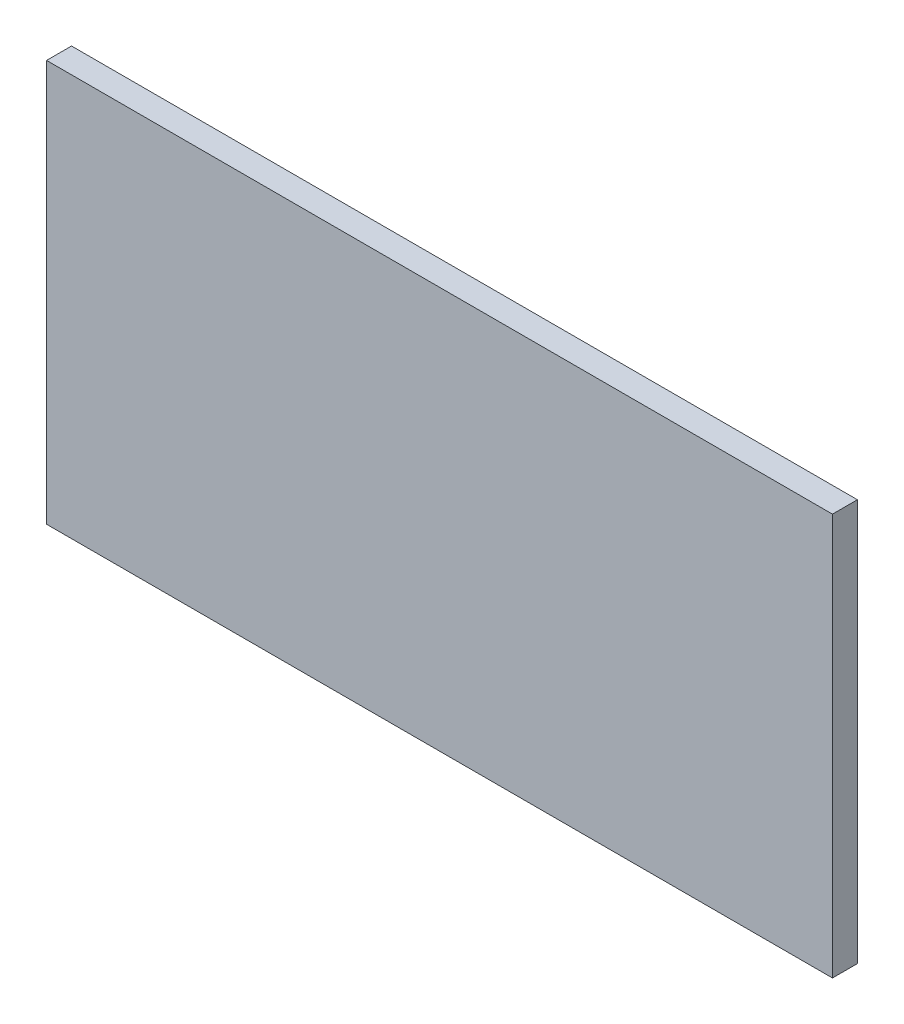
ISO-10303-21;
HEADER;
FILE_DESCRIPTION(('STEP AP214'),'2;1');
FILE_NAME('part.step','',(''),(''),'','','');
FILE_SCHEMA(('AUTOMOTIVE_DESIGN { 1 0 10303 214 1 1 1 1 }'));
ENDSEC;
DATA;
#1=APPLICATION_CONTEXT('core data for automotive mechanical design processes');
#2=APPLICATION_PROTOCOL_DEFINITION('international standard','automotive_design',2000,#1);
#3=PRODUCT_CONTEXT('',#1,'mechanical');
#4=PRODUCT('Part','Part','',(#3));
#5=PRODUCT_RELATED_PRODUCT_CATEGORY('part','',(#4));
#6=PRODUCT_DEFINITION_FORMATION('','',#4);
#7=PRODUCT_DEFINITION_CONTEXT('part definition',#1,'design');
#8=PRODUCT_DEFINITION('design','',#6,#7);
#9=PRODUCT_DEFINITION_SHAPE('','',#8);
#10=(LENGTH_UNIT() NAMED_UNIT(*) SI_UNIT(.MILLI.,.METRE.));
#11=(NAMED_UNIT(*) PLANE_ANGLE_UNIT() SI_UNIT($,.RADIAN.));
#12=(NAMED_UNIT(*) SI_UNIT($,.STERADIAN.) SOLID_ANGLE_UNIT());
#13=UNCERTAINTY_MEASURE_WITH_UNIT(LENGTH_MEASURE(1.E-05),#10,'distance_accuracy_value','');
#14=(GEOMETRIC_REPRESENTATION_CONTEXT(3) GLOBAL_UNCERTAINTY_ASSIGNED_CONTEXT((#13)) GLOBAL_UNIT_ASSIGNED_CONTEXT((#10,
#11,#12)) REPRESENTATION_CONTEXT('',''));
#15=CARTESIAN_POINT('',(0.,0.,0.));
#16=DIRECTION('',(0.,0.,1.));
#17=DIRECTION('',(1.,0.,0.));
#18=AXIS2_PLACEMENT_3D('',#15,#16,#17);
#19=CARTESIAN_POINT('',(-15.748,8.04999914,0.));
#20=DIRECTION('',(1.,0.,0.));
#21=DIRECTION('',(0.,-1.,0.));
#22=AXIS2_PLACEMENT_3D('',#19,#20,#21);
#23=PLANE('',#22);
#24=DIRECTION('',(0.,-1.,0.));
#25=VECTOR('',#24,1.);
#26=CARTESIAN_POINT('',(-15.748,8.04999914,0.));
#27=LINE('',#26,#25);
#28=CARTESIAN_POINT('',(-15.748,8.04999914,0.));
#29=VERTEX_POINT('',#28);
#30=CARTESIAN_POINT('',(-15.748,-8.04999914,0.));
#31=VERTEX_POINT('',#30);
#32=EDGE_CURVE('E11',#29,#31,#27,.T.);
#33=ORIENTED_EDGE('',*,*,#32,.T.);
#34=DIRECTION('',(0.,0.,1.));
#35=VECTOR('',#34,1.);
#36=CARTESIAN_POINT('',(-15.748,-8.04999914,0.));
#37=LINE('',#36,#35);
#38=CARTESIAN_POINT('',(-15.748,-8.04999914,1.00000054));
#39=VERTEX_POINT('',#38);
#40=EDGE_CURVE('E23',#31,#39,#37,.T.);
#41=ORIENTED_EDGE('',*,*,#40,.T.);
#42=DIRECTION('',(0.,-1.,0.));
#43=VECTOR('',#42,1.);
#44=CARTESIAN_POINT('',(-15.748,8.04999914,1.00000054));
#45=LINE('',#44,#43);
#46=CARTESIAN_POINT('',(-15.748,8.04999914,1.00000054));
#47=VERTEX_POINT('',#46);
#48=EDGE_CURVE('E86',#47,#39,#45,.T.);
#49=ORIENTED_EDGE('',*,*,#48,.F.);
#50=DIRECTION('',(0.,0.,1.));
#51=VECTOR('',#50,1.);
#52=CARTESIAN_POINT('',(-15.748,8.04999914,0.));
#53=LINE('',#52,#51);
#54=EDGE_CURVE('E37',#29,#47,#53,.T.);
#55=ORIENTED_EDGE('',*,*,#54,.F.);
#56=EDGE_LOOP('',(#33,#41,#49,#55));
#57=FACE_BOUND('',#56,.T.);
#58=ADVANCED_FACE('F16',(#57),#23,.F.);
#59=CARTESIAN_POINT('',(-15.748,-8.04999914,0.));
#60=DIRECTION('',(0.,1.,0.));
#61=DIRECTION('',(1.,0.,0.));
#62=AXIS2_PLACEMENT_3D('',#59,#60,#61);
#63=PLANE('',#62);
#64=DIRECTION('',(1.,0.,0.));
#65=VECTOR('',#64,1.);
#66=CARTESIAN_POINT('',(-15.748,-8.04999914,0.));
#67=LINE('',#66,#65);
#68=CARTESIAN_POINT('',(15.748,-8.04999914,0.));
#69=VERTEX_POINT('',#68);
#70=EDGE_CURVE('E30',#31,#69,#67,.T.);
#71=ORIENTED_EDGE('',*,*,#70,.T.);
#72=DIRECTION('',(0.,0.,1.));
#73=VECTOR('',#72,1.);
#74=CARTESIAN_POINT('',(15.748,-8.04999914,0.));
#75=LINE('',#74,#73);
#76=CARTESIAN_POINT('',(15.748,-8.04999914,1.00000054));
#77=VERTEX_POINT('',#76);
#78=EDGE_CURVE('E82',#69,#77,#75,.T.);
#79=ORIENTED_EDGE('',*,*,#78,.T.);
#80=DIRECTION('',(1.,0.,0.));
#81=VECTOR('',#80,1.);
#82=CARTESIAN_POINT('',(-15.748,-8.04999914,1.00000054));
#83=LINE('',#82,#81);
#84=EDGE_CURVE('E62',#39,#77,#83,.T.);
#85=ORIENTED_EDGE('',*,*,#84,.F.);
#86=ORIENTED_EDGE('',*,*,#40,.F.);
#87=EDGE_LOOP('',(#71,#79,#85,#86));
#88=FACE_BOUND('',#87,.T.);
#89=ADVANCED_FACE('F89',(#88),#63,.F.);
#90=CARTESIAN_POINT('',(15.748,-8.04999914,0.));
#91=DIRECTION('',(-1.,0.,0.));
#92=DIRECTION('',(0.,1.,0.));
#93=AXIS2_PLACEMENT_3D('',#90,#91,#92);
#94=PLANE('',#93);
#95=DIRECTION('',(0.,1.,0.));
#96=VECTOR('',#95,1.);
#97=CARTESIAN_POINT('',(15.748,-8.04999914,0.));
#98=LINE('',#97,#96);
#99=CARTESIAN_POINT('',(15.748,8.04999914,0.));
#100=VERTEX_POINT('',#99);
#101=EDGE_CURVE('E71',#69,#100,#98,.T.);
#102=ORIENTED_EDGE('',*,*,#101,.T.);
#103=DIRECTION('',(0.,0.,1.));
#104=VECTOR('',#103,1.);
#105=CARTESIAN_POINT('',(15.748,8.04999914,0.));
#106=LINE('',#105,#104);
#107=CARTESIAN_POINT('',(15.748,8.04999914,1.00000054));
#108=VERTEX_POINT('',#107);
#109=EDGE_CURVE('E66',#100,#108,#106,.T.);
#110=ORIENTED_EDGE('',*,*,#109,.T.);
#111=DIRECTION('',(0.,1.,0.));
#112=VECTOR('',#111,1.);
#113=CARTESIAN_POINT('',(15.748,-8.04999914,1.00000054));
#114=LINE('',#113,#112);
#115=EDGE_CURVE('E56',#77,#108,#114,.T.);
#116=ORIENTED_EDGE('',*,*,#115,.F.);
#117=ORIENTED_EDGE('',*,*,#78,.F.);
#118=EDGE_LOOP('',(#102,#110,#116,#117));
#119=FACE_BOUND('',#118,.T.);
#120=ADVANCED_FACE('F70',(#119),#94,.F.);
#121=CARTESIAN_POINT('',(15.748,8.04999914,0.));
#122=DIRECTION('',(0.,-1.,0.));
#123=DIRECTION('',(-1.,0.,0.));
#124=AXIS2_PLACEMENT_3D('',#121,#122,#123);
#125=PLANE('',#124);
#126=DIRECTION('',(-1.,0.,0.));
#127=VECTOR('',#126,1.);
#128=CARTESIAN_POINT('',(15.748,8.04999914,0.));
#129=LINE('',#128,#127);
#130=EDGE_CURVE('E67',#100,#29,#129,.T.);
#131=ORIENTED_EDGE('',*,*,#130,.T.);
#132=ORIENTED_EDGE('',*,*,#54,.T.);
#133=DIRECTION('',(-1.,0.,0.));
#134=VECTOR('',#133,1.);
#135=CARTESIAN_POINT('',(15.748,8.04999914,1.00000054));
#136=LINE('',#135,#134);
#137=EDGE_CURVE('E60',#108,#47,#136,.T.);
#138=ORIENTED_EDGE('',*,*,#137,.F.);
#139=ORIENTED_EDGE('',*,*,#109,.F.);
#140=EDGE_LOOP('',(#131,#132,#138,#139));
#141=FACE_BOUND('',#140,.T.);
#142=ADVANCED_FACE('F76',(#141),#125,.F.);
#143=CARTESIAN_POINT('',(0.,0.,0.));
#144=DIRECTION('',(0.,0.,1.));
#145=DIRECTION('',(-1.,0.,0.));
#146=AXIS2_PLACEMENT_3D('',#143,#144,#145);
#147=PLANE('',#146);
#148=ORIENTED_EDGE('',*,*,#130,.F.);
#149=ORIENTED_EDGE('',*,*,#101,.F.);
#150=ORIENTED_EDGE('',*,*,#70,.F.);
#151=ORIENTED_EDGE('',*,*,#32,.F.);
#152=EDGE_LOOP('',(#148,#149,#150,#151));
#153=FACE_BOUND('',#152,.T.);
#154=ADVANCED_FACE('F90',(#153),#147,.F.);
#155=CARTESIAN_POINT('',(0.,0.,1.00000054));
#156=DIRECTION('',(0.,0.,1.));
#157=DIRECTION('',(-1.,0.,0.));
#158=AXIS2_PLACEMENT_3D('',#155,#156,#157);
#159=PLANE('',#158);
#160=ORIENTED_EDGE('',*,*,#48,.T.);
#161=ORIENTED_EDGE('',*,*,#84,.T.);
#162=ORIENTED_EDGE('',*,*,#115,.T.);
#163=ORIENTED_EDGE('',*,*,#137,.T.);
#164=EDGE_LOOP('',(#160,#161,#162,#163));
#165=FACE_BOUND('',#164,.T.);
#166=ADVANCED_FACE('F58',(#165),#159,.T.);
#167=CLOSED_SHELL('',(#58,#89,#120,#142,#154,#166));
#168=MANIFOLD_SOLID_BREP('B1',#167);
#169=ADVANCED_BREP_SHAPE_REPRESENTATION('',(#18,#168),#14);
#170=SHAPE_DEFINITION_REPRESENTATION(#9,#169);
ENDSEC;
END-ISO-10303-21;
